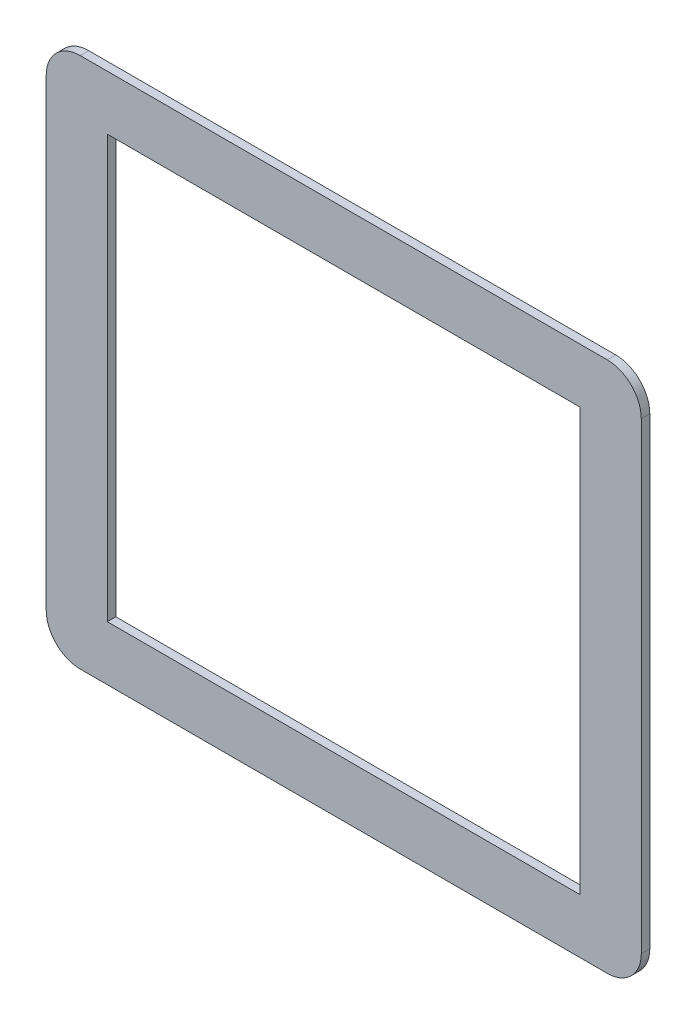
ISO-10303-21;
HEADER;
FILE_DESCRIPTION(('STEP AP214'),'2;1');
FILE_NAME('part.step','',(''),(''),'','','');
FILE_SCHEMA(('AUTOMOTIVE_DESIGN { 1 0 10303 214 1 1 1 1 }'));
ENDSEC;
DATA;
#1=APPLICATION_CONTEXT('core data for automotive mechanical design processes');
#2=APPLICATION_PROTOCOL_DEFINITION('international standard','automotive_design',2000,#1);
#3=PRODUCT_CONTEXT('',#1,'mechanical');
#4=PRODUCT('Part','Part','',(#3));
#5=PRODUCT_RELATED_PRODUCT_CATEGORY('part','',(#4));
#6=PRODUCT_DEFINITION_FORMATION('','',#4);
#7=PRODUCT_DEFINITION_CONTEXT('part definition',#1,'design');
#8=PRODUCT_DEFINITION('design','',#6,#7);
#9=PRODUCT_DEFINITION_SHAPE('','',#8);
#10=(LENGTH_UNIT() NAMED_UNIT(*) SI_UNIT(.MILLI.,.METRE.));
#11=(NAMED_UNIT(*) PLANE_ANGLE_UNIT() SI_UNIT($,.RADIAN.));
#12=(NAMED_UNIT(*) SI_UNIT($,.STERADIAN.) SOLID_ANGLE_UNIT());
#13=UNCERTAINTY_MEASURE_WITH_UNIT(LENGTH_MEASURE(1.E-05),#10,'distance_accuracy_value','');
#14=(GEOMETRIC_REPRESENTATION_CONTEXT(3) GLOBAL_UNCERTAINTY_ASSIGNED_CONTEXT((#13)) GLOBAL_UNIT_ASSIGNED_CONTEXT((#10,
#11,#12)) REPRESENTATION_CONTEXT('',''));
#15=CARTESIAN_POINT('',(0.,0.,0.));
#16=DIRECTION('',(0.,0.,1.));
#17=DIRECTION('',(1.,0.,0.));
#18=AXIS2_PLACEMENT_3D('',#15,#16,#17);
#19=CARTESIAN_POINT('',(-124.,-109.,4.));
#20=DIRECTION('',(0.,0.,1.));
#21=DIRECTION('',(1.,0.,0.));
#22=AXIS2_PLACEMENT_3D('',#19,#20,#21);
#23=PLANE('',#22);
#24=CARTESIAN_POINT('',(-124.,-109.,4.));
#25=DIRECTION('',(0.,0.,1.));
#26=DIRECTION('',(1.,0.,0.));
#27=AXIS2_PLACEMENT_3D('',#24,#25,#26);
#28=CIRCLE('',#27,16.);
#29=CARTESIAN_POINT('',(-140.,-109.,4.));
#30=VERTEX_POINT('',#29);
#31=CARTESIAN_POINT('',(-124.,-125.,4.));
#32=VERTEX_POINT('',#31);
#33=EDGE_CURVE('E159',#30,#32,#28,.T.);
#34=ORIENTED_EDGE('',*,*,#33,.T.);
#35=DIRECTION('',(1.,0.,0.));
#36=VECTOR('',#35,1.);
#37=CARTESIAN_POINT('',(-124.,-125.,4.));
#38=LINE('',#37,#36);
#39=CARTESIAN_POINT('',(124.,-125.,4.));
#40=VERTEX_POINT('',#39);
#41=EDGE_CURVE('E162',#32,#40,#38,.T.);
#42=ORIENTED_EDGE('',*,*,#41,.T.);
#43=CARTESIAN_POINT('',(124.,-109.,4.));
#44=DIRECTION('',(0.,0.,1.));
#45=DIRECTION('',(1.,0.,0.));
#46=AXIS2_PLACEMENT_3D('',#43,#44,#45);
#47=CIRCLE('',#46,16.);
#48=CARTESIAN_POINT('',(140.,-109.,4.));
#49=VERTEX_POINT('',#48);
#50=EDGE_CURVE('E165',#40,#49,#47,.T.);
#51=ORIENTED_EDGE('',*,*,#50,.T.);
#52=DIRECTION('',(0.,1.,0.));
#53=VECTOR('',#52,1.);
#54=CARTESIAN_POINT('',(140.,109.,4.));
#55=LINE('',#54,#53);
#56=CARTESIAN_POINT('',(140.,109.,4.));
#57=VERTEX_POINT('',#56);
#58=EDGE_CURVE('E167',#49,#57,#55,.T.);
#59=ORIENTED_EDGE('',*,*,#58,.T.);
#60=CARTESIAN_POINT('',(124.,109.,4.));
#61=DIRECTION('',(0.,0.,1.));
#62=DIRECTION('',(-1.,0.,0.));
#63=AXIS2_PLACEMENT_3D('',#60,#61,#62);
#64=CIRCLE('',#63,16.);
#65=CARTESIAN_POINT('',(124.,125.,4.));
#66=VERTEX_POINT('',#65);
#67=EDGE_CURVE('E169',#57,#66,#64,.T.);
#68=ORIENTED_EDGE('',*,*,#67,.T.);
#69=DIRECTION('',(-1.,0.,0.));
#70=VECTOR('',#69,1.);
#71=CARTESIAN_POINT('',(-124.,125.,4.));
#72=LINE('',#71,#70);
#73=CARTESIAN_POINT('',(-124.,125.,4.));
#74=VERTEX_POINT('',#73);
#75=EDGE_CURVE('E171',#66,#74,#72,.T.);
#76=ORIENTED_EDGE('',*,*,#75,.T.);
#77=CARTESIAN_POINT('',(-124.,109.,4.));
#78=DIRECTION('',(0.,0.,1.));
#79=DIRECTION('',(1.,0.,0.));
#80=AXIS2_PLACEMENT_3D('',#77,#78,#79);
#81=CIRCLE('',#80,16.);
#82=CARTESIAN_POINT('',(-140.,109.,4.));
#83=VERTEX_POINT('',#82);
#84=EDGE_CURVE('E173',#74,#83,#81,.T.);
#85=ORIENTED_EDGE('',*,*,#84,.T.);
#86=DIRECTION('',(0.,-1.,0.));
#87=VECTOR('',#86,1.);
#88=CARTESIAN_POINT('',(-140.,109.,4.));
#89=LINE('',#88,#87);
#90=EDGE_CURVE('E175',#83,#30,#89,.T.);
#91=ORIENTED_EDGE('',*,*,#90,.T.);
#92=EDGE_LOOP('',(#34,#42,#51,#59,#68,#76,#85,#91));
#93=FACE_BOUND('',#92,.T.);
#94=DIRECTION('',(1.,0.,0.));
#95=VECTOR('',#94,1.);
#96=CARTESIAN_POINT('',(111.251508095992,-99.3317036571357,4.));
#97=LINE('',#96,#95);
#98=CARTESIAN_POINT('',(-111.251508095992,-99.3317036571357,4.));
#99=VERTEX_POINT('',#98);
#100=CARTESIAN_POINT('',(111.251508095992,-99.3317036571357,4.));
#101=VERTEX_POINT('',#100);
#102=EDGE_CURVE('E131',#99,#101,#97,.T.);
#103=ORIENTED_EDGE('',*,*,#102,.F.);
#104=DIRECTION('',(0.,-1.,0.));
#105=VECTOR('',#104,1.);
#106=CARTESIAN_POINT('',(-111.251508095992,-99.3317036571357,4.));
#107=LINE('',#106,#105);
#108=CARTESIAN_POINT('',(-111.251508095992,99.3317036571358,4.));
#109=VERTEX_POINT('',#108);
#110=EDGE_CURVE('E123',#109,#99,#107,.T.);
#111=ORIENTED_EDGE('',*,*,#110,.F.);
#112=DIRECTION('',(-1.,0.,0.));
#113=VECTOR('',#112,1.);
#114=CARTESIAN_POINT('',(-111.251508095992,99.3317036571358,4.));
#115=LINE('',#114,#113);
#116=CARTESIAN_POINT('',(111.251508095992,99.3317036571358,4.));
#117=VERTEX_POINT('',#116);
#118=EDGE_CURVE('E145',#117,#109,#115,.T.);
#119=ORIENTED_EDGE('',*,*,#118,.F.);
#120=DIRECTION('',(0.,1.,0.));
#121=VECTOR('',#120,1.);
#122=CARTESIAN_POINT('',(111.251508095992,99.3317036571358,4.));
#123=LINE('',#122,#121);
#124=EDGE_CURVE('E143',#101,#117,#123,.T.);
#125=ORIENTED_EDGE('',*,*,#124,.F.);
#126=EDGE_LOOP('',(#103,#111,#119,#125));
#127=FACE_BOUND('',#126,.T.);
#128=ADVANCED_FACE('F34',(#93,#127),#23,.T.);
#129=CARTESIAN_POINT('',(-124.,-109.,0.));
#130=DIRECTION('',(0.,0.,1.));
#131=DIRECTION('',(1.,0.,0.));
#132=AXIS2_PLACEMENT_3D('',#129,#130,#131);
#133=PLANE('',#132);
#134=CARTESIAN_POINT('',(-124.,-109.,0.));
#135=DIRECTION('',(0.,0.,1.));
#136=DIRECTION('',(1.,0.,0.));
#137=AXIS2_PLACEMENT_3D('',#134,#135,#136);
#138=CIRCLE('',#137,16.);
#139=CARTESIAN_POINT('',(-140.,-109.,0.));
#140=VERTEX_POINT('',#139);
#141=CARTESIAN_POINT('',(-124.,-125.,0.));
#142=VERTEX_POINT('',#141);
#143=EDGE_CURVE('E139',#140,#142,#138,.T.);
#144=ORIENTED_EDGE('',*,*,#143,.F.);
#145=DIRECTION('',(0.,-1.,0.));
#146=VECTOR('',#145,1.);
#147=CARTESIAN_POINT('',(-140.,109.,0.));
#148=LINE('',#147,#146);
#149=CARTESIAN_POINT('',(-140.,109.,0.));
#150=VERTEX_POINT('',#149);
#151=EDGE_CURVE('E163',#150,#140,#148,.T.);
#152=ORIENTED_EDGE('',*,*,#151,.F.);
#153=CARTESIAN_POINT('',(-124.,109.,0.));
#154=DIRECTION('',(0.,0.,1.));
#155=DIRECTION('',(1.,0.,0.));
#156=AXIS2_PLACEMENT_3D('',#153,#154,#155);
#157=CIRCLE('',#156,16.);
#158=CARTESIAN_POINT('',(-124.,125.,0.));
#159=VERTEX_POINT('',#158);
#160=EDGE_CURVE('E190',#159,#150,#157,.T.);
#161=ORIENTED_EDGE('',*,*,#160,.F.);
#162=DIRECTION('',(-1.,0.,0.));
#163=VECTOR('',#162,1.);
#164=CARTESIAN_POINT('',(-124.,125.,0.));
#165=LINE('',#164,#163);
#166=CARTESIAN_POINT('',(124.,125.,0.));
#167=VERTEX_POINT('',#166);
#168=EDGE_CURVE('E188',#167,#159,#165,.T.);
#169=ORIENTED_EDGE('',*,*,#168,.F.);
#170=CARTESIAN_POINT('',(124.,109.,0.));
#171=DIRECTION('',(0.,0.,1.));
#172=DIRECTION('',(-1.,0.,0.));
#173=AXIS2_PLACEMENT_3D('',#170,#171,#172);
#174=CIRCLE('',#173,16.);
#175=CARTESIAN_POINT('',(140.,109.,0.));
#176=VERTEX_POINT('',#175);
#177=EDGE_CURVE('E186',#176,#167,#174,.T.);
#178=ORIENTED_EDGE('',*,*,#177,.F.);
#179=DIRECTION('',(0.,1.,0.));
#180=VECTOR('',#179,1.);
#181=CARTESIAN_POINT('',(140.,109.,0.));
#182=LINE('',#181,#180);
#183=CARTESIAN_POINT('',(140.,-109.,0.));
#184=VERTEX_POINT('',#183);
#185=EDGE_CURVE('E184',#184,#176,#182,.T.);
#186=ORIENTED_EDGE('',*,*,#185,.F.);
#187=CARTESIAN_POINT('',(124.,-109.,0.));
#188=DIRECTION('',(0.,0.,1.));
#189=DIRECTION('',(1.,0.,0.));
#190=AXIS2_PLACEMENT_3D('',#187,#188,#189);
#191=CIRCLE('',#190,16.);
#192=CARTESIAN_POINT('',(124.,-125.,0.));
#193=VERTEX_POINT('',#192);
#194=EDGE_CURVE('E182',#193,#184,#191,.T.);
#195=ORIENTED_EDGE('',*,*,#194,.F.);
#196=DIRECTION('',(1.,0.,0.));
#197=VECTOR('',#196,1.);
#198=CARTESIAN_POINT('',(-124.,-125.,0.));
#199=LINE('',#198,#197);
#200=EDGE_CURVE('E180',#142,#193,#199,.T.);
#201=ORIENTED_EDGE('',*,*,#200,.F.);
#202=EDGE_LOOP('',(#144,#152,#161,#169,#178,#186,#195,#201));
#203=FACE_BOUND('',#202,.T.);
#204=DIRECTION('',(0.,-1.,0.));
#205=VECTOR('',#204,1.);
#206=CARTESIAN_POINT('',(-111.251508095992,-99.3317036571357,0.));
#207=LINE('',#206,#205);
#208=CARTESIAN_POINT('',(-111.251508095992,99.3317036571358,0.));
#209=VERTEX_POINT('',#208);
#210=CARTESIAN_POINT('',(-111.251508095992,-99.3317036571357,0.));
#211=VERTEX_POINT('',#210);
#212=EDGE_CURVE('E57',#209,#211,#207,.T.);
#213=ORIENTED_EDGE('',*,*,#212,.T.);
#214=DIRECTION('',(1.,0.,0.));
#215=VECTOR('',#214,1.);
#216=CARTESIAN_POINT('',(111.251508095992,-99.3317036571357,0.));
#217=LINE('',#216,#215);
#218=CARTESIAN_POINT('',(111.251508095992,-99.3317036571357,0.));
#219=VERTEX_POINT('',#218);
#220=EDGE_CURVE('E138',#211,#219,#217,.T.);
#221=ORIENTED_EDGE('',*,*,#220,.T.);
#222=DIRECTION('',(0.,1.,0.));
#223=VECTOR('',#222,1.);
#224=CARTESIAN_POINT('',(111.251508095992,99.3317036571358,0.));
#225=LINE('',#224,#223);
#226=CARTESIAN_POINT('',(111.251508095992,99.3317036571358,0.));
#227=VERTEX_POINT('',#226);
#228=EDGE_CURVE('E151',#219,#227,#225,.T.);
#229=ORIENTED_EDGE('',*,*,#228,.T.);
#230=DIRECTION('',(-1.,0.,0.));
#231=VECTOR('',#230,1.);
#232=CARTESIAN_POINT('',(-111.251508095992,99.3317036571358,0.));
#233=LINE('',#232,#231);
#234=EDGE_CURVE('E132',#227,#209,#233,.T.);
#235=ORIENTED_EDGE('',*,*,#234,.T.);
#236=EDGE_LOOP('',(#213,#221,#229,#235));
#237=FACE_BOUND('',#236,.T.);
#238=ADVANCED_FACE('F220',(#203,#237),#133,.F.);
#239=CARTESIAN_POINT('',(-124.,-109.,4.));
#240=DIRECTION('',(0.,0.,-1.));
#241=DIRECTION('',(-1.,0.,0.));
#242=AXIS2_PLACEMENT_3D('',#239,#240,#241);
#243=CYLINDRICAL_SURFACE('',#242,16.);
#244=ORIENTED_EDGE('',*,*,#143,.T.);
#245=DIRECTION('',(0.,0.,-1.));
#246=VECTOR('',#245,1.);
#247=CARTESIAN_POINT('',(-124.,-125.,4.));
#248=LINE('',#247,#246);
#249=EDGE_CURVE('E11',#32,#142,#248,.T.);
#250=ORIENTED_EDGE('',*,*,#249,.F.);
#251=ORIENTED_EDGE('',*,*,#33,.F.);
#252=DIRECTION('',(0.,0.,-1.));
#253=VECTOR('',#252,1.);
#254=CARTESIAN_POINT('',(-140.,-109.,4.));
#255=LINE('',#254,#253);
#256=EDGE_CURVE('E177',#30,#140,#255,.T.);
#257=ORIENTED_EDGE('',*,*,#256,.T.);
#258=EDGE_LOOP('',(#244,#250,#251,#257));
#259=FACE_BOUND('',#258,.T.);
#260=ADVANCED_FACE('F36',(#259),#243,.T.);
#261=CARTESIAN_POINT('',(-124.,-125.,4.));
#262=DIRECTION('',(0.,1.,0.));
#263=DIRECTION('',(0.,0.,1.));
#264=AXIS2_PLACEMENT_3D('',#261,#262,#263);
#265=PLANE('',#264);
#266=ORIENTED_EDGE('',*,*,#200,.T.);
#267=DIRECTION('',(0.,0.,-1.));
#268=VECTOR('',#267,1.);
#269=CARTESIAN_POINT('',(124.,-125.,4.));
#270=LINE('',#269,#268);
#271=EDGE_CURVE('E42',#40,#193,#270,.T.);
#272=ORIENTED_EDGE('',*,*,#271,.F.);
#273=ORIENTED_EDGE('',*,*,#41,.F.);
#274=ORIENTED_EDGE('',*,*,#249,.T.);
#275=EDGE_LOOP('',(#266,#272,#273,#274));
#276=FACE_BOUND('',#275,.T.);
#277=ADVANCED_FACE('F237',(#276),#265,.F.);
#278=CARTESIAN_POINT('',(124.,-109.,4.));
#279=DIRECTION('',(0.,0.,-1.));
#280=DIRECTION('',(-1.,0.,0.));
#281=AXIS2_PLACEMENT_3D('',#278,#279,#280);
#282=CYLINDRICAL_SURFACE('',#281,16.);
#283=ORIENTED_EDGE('',*,*,#194,.T.);
#284=DIRECTION('',(0.,0.,-1.));
#285=VECTOR('',#284,1.);
#286=CARTESIAN_POINT('',(140.,-109.,4.));
#287=LINE('',#286,#285);
#288=EDGE_CURVE('E207',#49,#184,#287,.T.);
#289=ORIENTED_EDGE('',*,*,#288,.F.);
#290=ORIENTED_EDGE('',*,*,#50,.F.);
#291=ORIENTED_EDGE('',*,*,#271,.T.);
#292=EDGE_LOOP('',(#283,#289,#290,#291));
#293=FACE_BOUND('',#292,.T.);
#294=ADVANCED_FACE('F214',(#293),#282,.T.);
#295=CARTESIAN_POINT('',(140.,109.,4.));
#296=DIRECTION('',(-1.,0.,0.));
#297=DIRECTION('',(0.,0.,1.));
#298=AXIS2_PLACEMENT_3D('',#295,#296,#297);
#299=PLANE('',#298);
#300=ORIENTED_EDGE('',*,*,#185,.T.);
#301=DIRECTION('',(0.,0.,-1.));
#302=VECTOR('',#301,1.);
#303=CARTESIAN_POINT('',(140.,109.,4.));
#304=LINE('',#303,#302);
#305=EDGE_CURVE('E204',#57,#176,#304,.T.);
#306=ORIENTED_EDGE('',*,*,#305,.F.);
#307=ORIENTED_EDGE('',*,*,#58,.F.);
#308=ORIENTED_EDGE('',*,*,#288,.T.);
#309=EDGE_LOOP('',(#300,#306,#307,#308));
#310=FACE_BOUND('',#309,.T.);
#311=ADVANCED_FACE('F226',(#310),#299,.F.);
#312=CARTESIAN_POINT('',(124.,109.,4.));
#313=DIRECTION('',(0.,0.,-1.));
#314=DIRECTION('',(-1.,0.,0.));
#315=AXIS2_PLACEMENT_3D('',#312,#313,#314);
#316=CYLINDRICAL_SURFACE('',#315,16.);
#317=ORIENTED_EDGE('',*,*,#177,.T.);
#318=DIRECTION('',(0.,0.,-1.));
#319=VECTOR('',#318,1.);
#320=CARTESIAN_POINT('',(124.,125.,4.));
#321=LINE('',#320,#319);
#322=EDGE_CURVE('E201',#66,#167,#321,.T.);
#323=ORIENTED_EDGE('',*,*,#322,.F.);
#324=ORIENTED_EDGE('',*,*,#67,.F.);
#325=ORIENTED_EDGE('',*,*,#305,.T.);
#326=EDGE_LOOP('',(#317,#323,#324,#325));
#327=FACE_BOUND('',#326,.T.);
#328=ADVANCED_FACE('F230',(#327),#316,.T.);
#329=CARTESIAN_POINT('',(-124.,125.,4.));
#330=DIRECTION('',(0.,-1.,0.));
#331=DIRECTION('',(0.,0.,-1.));
#332=AXIS2_PLACEMENT_3D('',#329,#330,#331);
#333=PLANE('',#332);
#334=ORIENTED_EDGE('',*,*,#168,.T.);
#335=DIRECTION('',(0.,0.,-1.));
#336=VECTOR('',#335,1.);
#337=CARTESIAN_POINT('',(-124.,125.,4.));
#338=LINE('',#337,#336);
#339=EDGE_CURVE('E198',#74,#159,#338,.T.);
#340=ORIENTED_EDGE('',*,*,#339,.F.);
#341=ORIENTED_EDGE('',*,*,#75,.F.);
#342=ORIENTED_EDGE('',*,*,#322,.T.);
#343=EDGE_LOOP('',(#334,#340,#341,#342));
#344=FACE_BOUND('',#343,.T.);
#345=ADVANCED_FACE('F250',(#344),#333,.F.);
#346=CARTESIAN_POINT('',(-124.,109.,4.));
#347=DIRECTION('',(0.,0.,-1.));
#348=DIRECTION('',(-1.,0.,0.));
#349=AXIS2_PLACEMENT_3D('',#346,#347,#348);
#350=CYLINDRICAL_SURFACE('',#349,16.);
#351=ORIENTED_EDGE('',*,*,#160,.T.);
#352=DIRECTION('',(0.,0.,-1.));
#353=VECTOR('',#352,1.);
#354=CARTESIAN_POINT('',(-140.,109.,4.));
#355=LINE('',#354,#353);
#356=EDGE_CURVE('E195',#83,#150,#355,.T.);
#357=ORIENTED_EDGE('',*,*,#356,.F.);
#358=ORIENTED_EDGE('',*,*,#84,.F.);
#359=ORIENTED_EDGE('',*,*,#339,.T.);
#360=EDGE_LOOP('',(#351,#357,#358,#359));
#361=FACE_BOUND('',#360,.T.);
#362=ADVANCED_FACE('F248',(#361),#350,.T.);
#363=CARTESIAN_POINT('',(-140.,109.,4.));
#364=DIRECTION('',(1.,0.,0.));
#365=DIRECTION('',(0.,1.,0.));
#366=AXIS2_PLACEMENT_3D('',#363,#364,#365);
#367=PLANE('',#366);
#368=ORIENTED_EDGE('',*,*,#151,.T.);
#369=ORIENTED_EDGE('',*,*,#256,.F.);
#370=ORIENTED_EDGE('',*,*,#90,.F.);
#371=ORIENTED_EDGE('',*,*,#356,.T.);
#372=EDGE_LOOP('',(#368,#369,#370,#371));
#373=FACE_BOUND('',#372,.T.);
#374=ADVANCED_FACE('F243',(#373),#367,.F.);
#375=CARTESIAN_POINT('',(-111.251508095992,-99.3317036571357,4.));
#376=DIRECTION('',(1.,0.,0.));
#377=DIRECTION('',(0.,0.,-1.));
#378=AXIS2_PLACEMENT_3D('',#375,#376,#377);
#379=PLANE('',#378);
#380=ORIENTED_EDGE('',*,*,#212,.F.);
#381=DIRECTION('',(0.,0.,-1.));
#382=VECTOR('',#381,1.);
#383=CARTESIAN_POINT('',(-111.251508095992,99.3317036571358,4.));
#384=LINE('',#383,#382);
#385=EDGE_CURVE('E127',#109,#209,#384,.T.);
#386=ORIENTED_EDGE('',*,*,#385,.F.);
#387=ORIENTED_EDGE('',*,*,#110,.T.);
#388=DIRECTION('',(0.,0.,-1.));
#389=VECTOR('',#388,1.);
#390=CARTESIAN_POINT('',(-111.251508095992,-99.3317036571357,4.));
#391=LINE('',#390,#389);
#392=EDGE_CURVE('E126',#99,#211,#391,.T.);
#393=ORIENTED_EDGE('',*,*,#392,.T.);
#394=EDGE_LOOP('',(#380,#386,#387,#393));
#395=FACE_BOUND('',#394,.T.);
#396=ADVANCED_FACE('F125',(#395),#379,.T.);
#397=CARTESIAN_POINT('',(111.251508095992,-99.3317036571357,4.));
#398=DIRECTION('',(0.,1.,0.));
#399=DIRECTION('',(0.,0.,1.));
#400=AXIS2_PLACEMENT_3D('',#397,#398,#399);
#401=PLANE('',#400);
#402=ORIENTED_EDGE('',*,*,#220,.F.);
#403=ORIENTED_EDGE('',*,*,#392,.F.);
#404=ORIENTED_EDGE('',*,*,#102,.T.);
#405=DIRECTION('',(0.,0.,-1.));
#406=VECTOR('',#405,1.);
#407=CARTESIAN_POINT('',(111.251508095992,-99.3317036571357,4.));
#408=LINE('',#407,#406);
#409=EDGE_CURVE('E140',#101,#219,#408,.T.);
#410=ORIENTED_EDGE('',*,*,#409,.T.);
#411=EDGE_LOOP('',(#402,#403,#404,#410));
#412=FACE_BOUND('',#411,.T.);
#413=ADVANCED_FACE('F135',(#412),#401,.T.);
#414=CARTESIAN_POINT('',(111.251508095992,99.3317036571358,4.));
#415=DIRECTION('',(-1.,0.,0.));
#416=DIRECTION('',(0.,0.,1.));
#417=AXIS2_PLACEMENT_3D('',#414,#415,#416);
#418=PLANE('',#417);
#419=ORIENTED_EDGE('',*,*,#228,.F.);
#420=ORIENTED_EDGE('',*,*,#409,.F.);
#421=ORIENTED_EDGE('',*,*,#124,.T.);
#422=DIRECTION('',(0.,0.,-1.));
#423=VECTOR('',#422,1.);
#424=CARTESIAN_POINT('',(111.251508095992,99.3317036571358,4.));
#425=LINE('',#424,#423);
#426=EDGE_CURVE('E49',#117,#227,#425,.T.);
#427=ORIENTED_EDGE('',*,*,#426,.T.);
#428=EDGE_LOOP('',(#419,#420,#421,#427));
#429=FACE_BOUND('',#428,.T.);
#430=ADVANCED_FACE('F275',(#429),#418,.T.);
#431=CARTESIAN_POINT('',(-111.251508095992,99.3317036571358,4.));
#432=DIRECTION('',(0.,-1.,0.));
#433=DIRECTION('',(0.,0.,-1.));
#434=AXIS2_PLACEMENT_3D('',#431,#432,#433);
#435=PLANE('',#434);
#436=ORIENTED_EDGE('',*,*,#234,.F.);
#437=ORIENTED_EDGE('',*,*,#426,.F.);
#438=ORIENTED_EDGE('',*,*,#118,.T.);
#439=ORIENTED_EDGE('',*,*,#385,.T.);
#440=EDGE_LOOP('',(#436,#437,#438,#439));
#441=FACE_BOUND('',#440,.T.);
#442=ADVANCED_FACE('F279',(#441),#435,.T.);
#443=CLOSED_SHELL('',(#128,#238,#260,#277,#294,#311,#328,#345,#362,#374,#396,#413,#430,#442));
#444=MANIFOLD_SOLID_BREP('B2',#443);
#445=ADVANCED_BREP_SHAPE_REPRESENTATION('',(#18,#444),#14);
#446=SHAPE_DEFINITION_REPRESENTATION(#9,#445);
ENDSEC;
END-ISO-10303-21;
